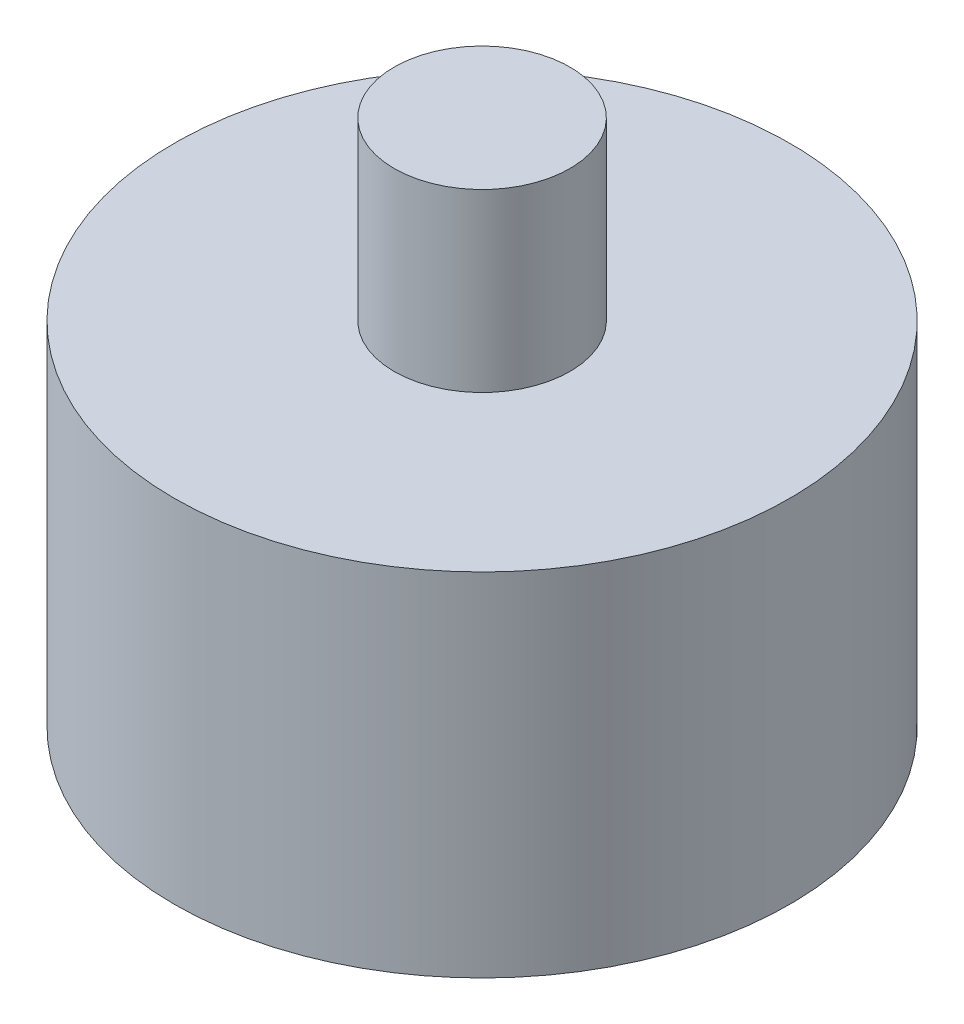
ISO-10303-21;
HEADER;
FILE_DESCRIPTION(('STEP AP214'),'2;1');
FILE_NAME('part.step','',(''),(''),'','','');
FILE_SCHEMA(('AUTOMOTIVE_DESIGN { 1 0 10303 214 1 1 1 1 }'));
ENDSEC;
DATA;
#1=APPLICATION_CONTEXT('core data for automotive mechanical design processes');
#2=APPLICATION_PROTOCOL_DEFINITION('international standard','automotive_design',2000,#1);
#3=PRODUCT_CONTEXT('',#1,'mechanical');
#4=PRODUCT('Part','Part','',(#3));
#5=PRODUCT_RELATED_PRODUCT_CATEGORY('part','',(#4));
#6=PRODUCT_DEFINITION_FORMATION('','',#4);
#7=PRODUCT_DEFINITION_CONTEXT('part definition',#1,'design');
#8=PRODUCT_DEFINITION('design','',#6,#7);
#9=PRODUCT_DEFINITION_SHAPE('','',#8);
#10=(LENGTH_UNIT() NAMED_UNIT(*) SI_UNIT(.MILLI.,.METRE.));
#11=(NAMED_UNIT(*) PLANE_ANGLE_UNIT() SI_UNIT($,.RADIAN.));
#12=(NAMED_UNIT(*) SI_UNIT($,.STERADIAN.) SOLID_ANGLE_UNIT());
#13=UNCERTAINTY_MEASURE_WITH_UNIT(LENGTH_MEASURE(1.E-05),#10,'distance_accuracy_value','');
#14=(GEOMETRIC_REPRESENTATION_CONTEXT(3) GLOBAL_UNCERTAINTY_ASSIGNED_CONTEXT((#13)) GLOBAL_UNIT_ASSIGNED_CONTEXT((#10,
#11,#12)) REPRESENTATION_CONTEXT('',''));
#15=CARTESIAN_POINT('',(0.,0.,0.));
#16=DIRECTION('',(0.,0.,1.));
#17=DIRECTION('',(1.,0.,0.));
#18=AXIS2_PLACEMENT_3D('',#15,#16,#17);
#19=CARTESIAN_POINT('',(0.,20.,0.));
#20=DIRECTION('',(0.,-1.,0.));
#21=DIRECTION('',(0.,0.,-1.));
#22=AXIS2_PLACEMENT_3D('',#19,#20,#21);
#23=CYLINDRICAL_SURFACE('',#22,17.5);
#24=CARTESIAN_POINT('',(0.,20.,0.));
#25=DIRECTION('',(0.,1.,0.));
#26=DIRECTION('',(0.,0.,1.));
#27=AXIS2_PLACEMENT_3D('',#24,#25,#26);
#28=CIRCLE('',#27,17.5);
#29=CARTESIAN_POINT('',(0.,20.,17.5));
#30=VERTEX_POINT('',#29);
#31=EDGE_CURVE('E40',#30,#30,#28,.T.);
#32=ORIENTED_EDGE('',*,*,#31,.F.);
#33=EDGE_LOOP('',(#32));
#34=FACE_BOUND('',#33,.T.);
#35=CARTESIAN_POINT('',(0.,0.,0.));
#36=DIRECTION('',(0.,1.,0.));
#37=DIRECTION('',(0.,0.,1.));
#38=AXIS2_PLACEMENT_3D('',#35,#36,#37);
#39=CIRCLE('',#38,17.5);
#40=CARTESIAN_POINT('',(0.,0.,17.5));
#41=VERTEX_POINT('',#40);
#42=EDGE_CURVE('E36',#41,#41,#39,.T.);
#43=ORIENTED_EDGE('',*,*,#42,.T.);
#44=EDGE_LOOP('',(#43));
#45=FACE_BOUND('',#44,.T.);
#46=ADVANCED_FACE('F33',(#34,#45),#23,.T.);
#47=CARTESIAN_POINT('',(0.,20.,0.));
#48=DIRECTION('',(0.,1.,0.));
#49=DIRECTION('',(0.,0.,1.));
#50=AXIS2_PLACEMENT_3D('',#47,#48,#49);
#51=PLANE('',#50);
#52=CARTESIAN_POINT('',(0.,20.,0.));
#53=DIRECTION('',(0.,1.,0.));
#54=DIRECTION('',(0.,0.,1.));
#55=AXIS2_PLACEMENT_3D('',#52,#53,#54);
#56=CIRCLE('',#55,5.);
#57=CARTESIAN_POINT('',(0.,20.,5.));
#58=VERTEX_POINT('',#57);
#59=EDGE_CURVE('E10',#58,#58,#56,.T.);
#60=ORIENTED_EDGE('',*,*,#59,.F.);
#61=EDGE_LOOP('',(#60));
#62=FACE_BOUND('',#61,.T.);
#63=ORIENTED_EDGE('',*,*,#31,.T.);
#64=EDGE_LOOP('',(#63));
#65=FACE_BOUND('',#64,.T.);
#66=ADVANCED_FACE('F57',(#62,#65),#51,.T.);
#67=CARTESIAN_POINT('',(0.,0.,0.));
#68=DIRECTION('',(0.,1.,0.));
#69=DIRECTION('',(0.,0.,1.));
#70=AXIS2_PLACEMENT_3D('',#67,#68,#69);
#71=PLANE('',#70);
#72=ORIENTED_EDGE('',*,*,#42,.F.);
#73=EDGE_LOOP('',(#72));
#74=FACE_BOUND('',#73,.T.);
#75=ADVANCED_FACE('F54',(#74),#71,.F.);
#76=CARTESIAN_POINT('',(0.,30.,0.));
#77=DIRECTION('',(0.,-1.,0.));
#78=DIRECTION('',(0.,0.,-1.));
#79=AXIS2_PLACEMENT_3D('',#76,#77,#78);
#80=CYLINDRICAL_SURFACE('',#79,5.);
#81=CARTESIAN_POINT('',(0.,30.,0.));
#82=DIRECTION('',(0.,1.,0.));
#83=DIRECTION('',(0.,0.,1.));
#84=AXIS2_PLACEMENT_3D('',#81,#82,#83);
#85=CIRCLE('',#84,5.);
#86=CARTESIAN_POINT('',(0.,30.,5.));
#87=VERTEX_POINT('',#86);
#88=EDGE_CURVE('E46',#87,#87,#85,.T.);
#89=ORIENTED_EDGE('',*,*,#88,.F.);
#90=EDGE_LOOP('',(#89));
#91=FACE_BOUND('',#90,.T.);
#92=ORIENTED_EDGE('',*,*,#59,.T.);
#93=EDGE_LOOP('',(#92));
#94=FACE_BOUND('',#93,.T.);
#95=ADVANCED_FACE('F56',(#91,#94),#80,.T.);
#96=CARTESIAN_POINT('',(0.,30.,0.));
#97=DIRECTION('',(0.,1.,0.));
#98=DIRECTION('',(0.,0.,1.));
#99=AXIS2_PLACEMENT_3D('',#96,#97,#98);
#100=PLANE('',#99);
#101=ORIENTED_EDGE('',*,*,#88,.T.);
#102=EDGE_LOOP('',(#101));
#103=FACE_BOUND('',#102,.T.);
#104=ADVANCED_FACE('F62',(#103),#100,.T.);
#105=CLOSED_SHELL('',(#46,#66,#75,#95,#104));
#106=MANIFOLD_SOLID_BREP('B2',#105);
#107=ADVANCED_BREP_SHAPE_REPRESENTATION('',(#18,#106),#14);
#108=SHAPE_DEFINITION_REPRESENTATION(#9,#107);
ENDSEC;
END-ISO-10303-21;
